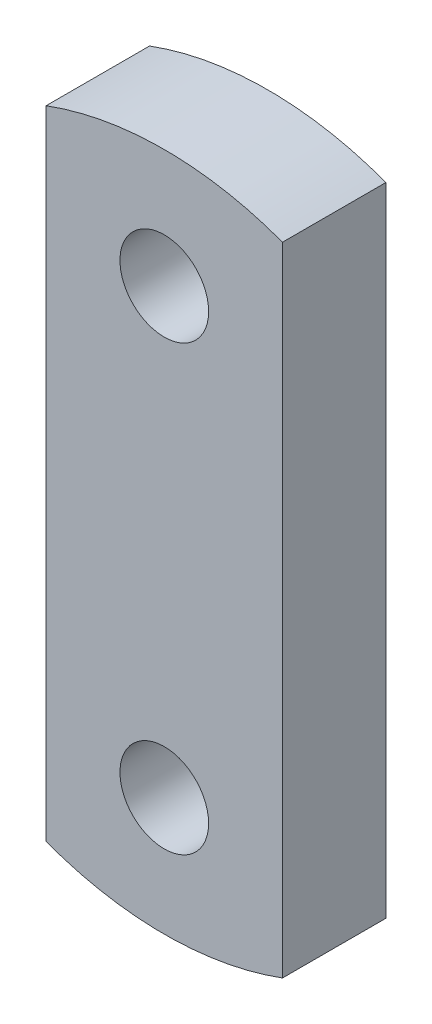
ISO-10303-21;
HEADER;
FILE_DESCRIPTION(('STEP AP214'),'2;1');
FILE_NAME('part.step','',(''),(''),'','','');
FILE_SCHEMA(('AUTOMOTIVE_DESIGN { 1 0 10303 214 1 1 1 1 }'));
ENDSEC;
DATA;
#1=APPLICATION_CONTEXT('core data for automotive mechanical design processes');
#2=APPLICATION_PROTOCOL_DEFINITION('international standard','automotive_design',2000,#1);
#3=PRODUCT_CONTEXT('',#1,'mechanical');
#4=PRODUCT('Part','Part','',(#3));
#5=PRODUCT_RELATED_PRODUCT_CATEGORY('part','',(#4));
#6=PRODUCT_DEFINITION_FORMATION('','',#4);
#7=PRODUCT_DEFINITION_CONTEXT('part definition',#1,'design');
#8=PRODUCT_DEFINITION('design','',#6,#7);
#9=PRODUCT_DEFINITION_SHAPE('','',#8);
#10=(LENGTH_UNIT() NAMED_UNIT(*) SI_UNIT(.MILLI.,.METRE.));
#11=(NAMED_UNIT(*) PLANE_ANGLE_UNIT() SI_UNIT($,.RADIAN.));
#12=(NAMED_UNIT(*) SI_UNIT($,.STERADIAN.) SOLID_ANGLE_UNIT());
#13=UNCERTAINTY_MEASURE_WITH_UNIT(LENGTH_MEASURE(1.E-05),#10,'distance_accuracy_value','');
#14=(GEOMETRIC_REPRESENTATION_CONTEXT(3) GLOBAL_UNCERTAINTY_ASSIGNED_CONTEXT((#13)) GLOBAL_UNIT_ASSIGNED_CONTEXT((#10,
#11,#12)) REPRESENTATION_CONTEXT('',''));
#15=CARTESIAN_POINT('',(0.,0.,0.));
#16=DIRECTION('',(0.,0.,1.));
#17=DIRECTION('',(1.,0.,0.));
#18=AXIS2_PLACEMENT_3D('',#15,#16,#17);
#19=CARTESIAN_POINT('',(0.,0.,35.));
#20=DIRECTION('',(0.,0.,1.));
#21=DIRECTION('',(1.,0.,0.));
#22=AXIS2_PLACEMENT_3D('',#19,#20,#21);
#23=PLANE('',#22);
#24=CARTESIAN_POINT('',(0.,75.,35.));
#25=DIRECTION('',(0.,0.,1.));
#26=DIRECTION('',(1.,0.,0.));
#27=AXIS2_PLACEMENT_3D('',#24,#25,#26);
#28=CIRCLE('',#27,15.);
#29=CARTESIAN_POINT('',(15.,75.,35.));
#30=VERTEX_POINT('',#29);
#31=EDGE_CURVE('E100',#30,#30,#28,.T.);
#32=ORIENTED_EDGE('',*,*,#31,.F.);
#33=EDGE_LOOP('',(#32));
#34=FACE_BOUND('',#33,.T.);
#35=CARTESIAN_POINT('',(0.,0.,35.));
#36=DIRECTION('',(0.,0.,1.));
#37=DIRECTION('',(1.,0.,0.));
#38=AXIS2_PLACEMENT_3D('',#35,#36,#37);
#39=CIRCLE('',#38,115.);
#40=CARTESIAN_POINT('',(40.,107.819293264239,35.));
#41=VERTEX_POINT('',#40);
#42=CARTESIAN_POINT('',(-40.,107.819293264239,35.));
#43=VERTEX_POINT('',#42);
#44=EDGE_CURVE('E85',#41,#43,#39,.T.);
#45=ORIENTED_EDGE('',*,*,#44,.T.);
#46=DIRECTION('',(0.,-1.,0.));
#47=VECTOR('',#46,1.);
#48=CARTESIAN_POINT('',(-40.,107.819293264239,35.));
#49=LINE('',#48,#47);
#50=CARTESIAN_POINT('',(-40.,-107.819293264239,35.));
#51=VERTEX_POINT('',#50);
#52=EDGE_CURVE('E80',#43,#51,#49,.T.);
#53=ORIENTED_EDGE('',*,*,#52,.T.);
#54=CARTESIAN_POINT('',(0.,0.,35.));
#55=DIRECTION('',(0.,0.,1.));
#56=DIRECTION('',(1.,0.,0.));
#57=AXIS2_PLACEMENT_3D('',#54,#55,#56);
#58=CIRCLE('',#57,115.);
#59=CARTESIAN_POINT('',(40.,-107.819293264239,35.));
#60=VERTEX_POINT('',#59);
#61=EDGE_CURVE('E83',#51,#60,#58,.T.);
#62=ORIENTED_EDGE('',*,*,#61,.T.);
#63=DIRECTION('',(0.,1.,0.));
#64=VECTOR('',#63,1.);
#65=CARTESIAN_POINT('',(40.,107.819293264239,35.));
#66=LINE('',#65,#64);
#67=EDGE_CURVE('E50',#60,#41,#66,.T.);
#68=ORIENTED_EDGE('',*,*,#67,.T.);
#69=EDGE_LOOP('',(#45,#53,#62,#68));
#70=FACE_BOUND('',#69,.T.);
#71=CARTESIAN_POINT('',(0.,-75.,35.));
#72=DIRECTION('',(0.,0.,1.));
#73=DIRECTION('',(1.,0.,0.));
#74=AXIS2_PLACEMENT_3D('',#71,#72,#73);
#75=CIRCLE('',#74,15.);
#76=CARTESIAN_POINT('',(15.,-75.,35.));
#77=VERTEX_POINT('',#76);
#78=EDGE_CURVE('E115',#77,#77,#75,.T.);
#79=ORIENTED_EDGE('',*,*,#78,.F.);
#80=EDGE_LOOP('',(#79));
#81=FACE_BOUND('',#80,.T.);
#82=ADVANCED_FACE('F33',(#34,#70,#81),#23,.T.);
#83=CARTESIAN_POINT('',(0.,0.,0.));
#84=DIRECTION('',(0.,0.,1.));
#85=DIRECTION('',(1.,0.,0.));
#86=AXIS2_PLACEMENT_3D('',#83,#84,#85);
#87=PLANE('',#86);
#88=CARTESIAN_POINT('',(0.,0.,0.));
#89=DIRECTION('',(0.,0.,1.));
#90=DIRECTION('',(1.,0.,0.));
#91=AXIS2_PLACEMENT_3D('',#88,#89,#90);
#92=CIRCLE('',#91,115.);
#93=CARTESIAN_POINT('',(40.,107.819293264239,0.));
#94=VERTEX_POINT('',#93);
#95=CARTESIAN_POINT('',(-40.,107.819293264239,0.));
#96=VERTEX_POINT('',#95);
#97=EDGE_CURVE('E97',#94,#96,#92,.T.);
#98=ORIENTED_EDGE('',*,*,#97,.F.);
#99=DIRECTION('',(0.,1.,0.));
#100=VECTOR('',#99,1.);
#101=CARTESIAN_POINT('',(40.,107.819293264239,0.));
#102=LINE('',#101,#100);
#103=CARTESIAN_POINT('',(40.,-107.819293264239,0.));
#104=VERTEX_POINT('',#103);
#105=EDGE_CURVE('E73',#104,#94,#102,.T.);
#106=ORIENTED_EDGE('',*,*,#105,.F.);
#107=CARTESIAN_POINT('',(0.,0.,0.));
#108=DIRECTION('',(0.,0.,1.));
#109=DIRECTION('',(1.,0.,0.));
#110=AXIS2_PLACEMENT_3D('',#107,#108,#109);
#111=CIRCLE('',#110,115.);
#112=CARTESIAN_POINT('',(-40.,-107.819293264239,0.));
#113=VERTEX_POINT('',#112);
#114=EDGE_CURVE('E67',#113,#104,#111,.T.);
#115=ORIENTED_EDGE('',*,*,#114,.F.);
#116=DIRECTION('',(0.,-1.,0.));
#117=VECTOR('',#116,1.);
#118=CARTESIAN_POINT('',(-40.,107.819293264239,0.));
#119=LINE('',#118,#117);
#120=EDGE_CURVE('E89',#96,#113,#119,.T.);
#121=ORIENTED_EDGE('',*,*,#120,.F.);
#122=EDGE_LOOP('',(#98,#106,#115,#121));
#123=FACE_BOUND('',#122,.T.);
#124=CARTESIAN_POINT('',(0.,75.,0.));
#125=DIRECTION('',(0.,0.,1.));
#126=DIRECTION('',(1.,0.,0.));
#127=AXIS2_PLACEMENT_3D('',#124,#125,#126);
#128=CIRCLE('',#127,15.);
#129=CARTESIAN_POINT('',(15.,75.,0.));
#130=VERTEX_POINT('',#129);
#131=EDGE_CURVE('E112',#130,#130,#128,.T.);
#132=ORIENTED_EDGE('',*,*,#131,.T.);
#133=EDGE_LOOP('',(#132));
#134=FACE_BOUND('',#133,.T.);
#135=CARTESIAN_POINT('',(0.,-75.,0.));
#136=DIRECTION('',(0.,0.,1.));
#137=DIRECTION('',(1.,0.,0.));
#138=AXIS2_PLACEMENT_3D('',#135,#136,#137);
#139=CIRCLE('',#138,15.);
#140=CARTESIAN_POINT('',(15.,-75.,0.));
#141=VERTEX_POINT('',#140);
#142=EDGE_CURVE('E118',#141,#141,#139,.T.);
#143=ORIENTED_EDGE('',*,*,#142,.T.);
#144=EDGE_LOOP('',(#143));
#145=FACE_BOUND('',#144,.T.);
#146=ADVANCED_FACE('F108',(#123,#134,#145),#87,.F.);
#147=CARTESIAN_POINT('',(0.,0.,35.));
#148=DIRECTION('',(0.,0.,-1.));
#149=DIRECTION('',(-1.,0.,0.));
#150=AXIS2_PLACEMENT_3D('',#147,#148,#149);
#151=CYLINDRICAL_SURFACE('',#150,115.);
#152=ORIENTED_EDGE('',*,*,#97,.T.);
#153=DIRECTION('',(0.,0.,-1.));
#154=VECTOR('',#153,1.);
#155=CARTESIAN_POINT('',(-40.,107.819293264239,35.));
#156=LINE('',#155,#154);
#157=EDGE_CURVE('E11',#43,#96,#156,.T.);
#158=ORIENTED_EDGE('',*,*,#157,.F.);
#159=ORIENTED_EDGE('',*,*,#44,.F.);
#160=DIRECTION('',(0.,0.,-1.));
#161=VECTOR('',#160,1.);
#162=CARTESIAN_POINT('',(40.,107.819293264239,35.));
#163=LINE('',#162,#161);
#164=EDGE_CURVE('E93',#41,#94,#163,.T.);
#165=ORIENTED_EDGE('',*,*,#164,.T.);
#166=EDGE_LOOP('',(#152,#158,#159,#165));
#167=FACE_BOUND('',#166,.T.);
#168=ADVANCED_FACE('F35',(#167),#151,.T.);
#169=CARTESIAN_POINT('',(-40.,107.819293264239,35.));
#170=DIRECTION('',(1.,0.,0.));
#171=DIRECTION('',(0.,1.,0.));
#172=AXIS2_PLACEMENT_3D('',#169,#170,#171);
#173=PLANE('',#172);
#174=ORIENTED_EDGE('',*,*,#120,.T.);
#175=DIRECTION('',(0.,0.,-1.));
#176=VECTOR('',#175,1.);
#177=CARTESIAN_POINT('',(-40.,-107.819293264239,35.));
#178=LINE('',#177,#176);
#179=EDGE_CURVE('E42',#51,#113,#178,.T.);
#180=ORIENTED_EDGE('',*,*,#179,.F.);
#181=ORIENTED_EDGE('',*,*,#52,.F.);
#182=ORIENTED_EDGE('',*,*,#157,.T.);
#183=EDGE_LOOP('',(#174,#180,#181,#182));
#184=FACE_BOUND('',#183,.T.);
#185=ADVANCED_FACE('F88',(#184),#173,.F.);
#186=CARTESIAN_POINT('',(0.,0.,35.));
#187=DIRECTION('',(0.,0.,-1.));
#188=DIRECTION('',(-1.,0.,0.));
#189=AXIS2_PLACEMENT_3D('',#186,#187,#188);
#190=CYLINDRICAL_SURFACE('',#189,115.);
#191=ORIENTED_EDGE('',*,*,#114,.T.);
#192=DIRECTION('',(0.,0.,-1.));
#193=VECTOR('',#192,1.);
#194=CARTESIAN_POINT('',(40.,-107.819293264239,35.));
#195=LINE('',#194,#193);
#196=EDGE_CURVE('E90',#60,#104,#195,.T.);
#197=ORIENTED_EDGE('',*,*,#196,.F.);
#198=ORIENTED_EDGE('',*,*,#61,.F.);
#199=ORIENTED_EDGE('',*,*,#179,.T.);
#200=EDGE_LOOP('',(#191,#197,#198,#199));
#201=FACE_BOUND('',#200,.T.);
#202=ADVANCED_FACE('F91',(#201),#190,.T.);
#203=CARTESIAN_POINT('',(40.,107.819293264239,35.));
#204=DIRECTION('',(-1.,0.,0.));
#205=DIRECTION('',(0.,-1.,0.));
#206=AXIS2_PLACEMENT_3D('',#203,#204,#205);
#207=PLANE('',#206);
#208=ORIENTED_EDGE('',*,*,#105,.T.);
#209=ORIENTED_EDGE('',*,*,#164,.F.);
#210=ORIENTED_EDGE('',*,*,#67,.F.);
#211=ORIENTED_EDGE('',*,*,#196,.T.);
#212=EDGE_LOOP('',(#208,#209,#210,#211));
#213=FACE_BOUND('',#212,.T.);
#214=ADVANCED_FACE('F105',(#213),#207,.F.);
#215=CARTESIAN_POINT('',(0.,75.,35.));
#216=DIRECTION('',(0.,0.,-1.));
#217=DIRECTION('',(-1.,0.,0.));
#218=AXIS2_PLACEMENT_3D('',#215,#216,#217);
#219=CYLINDRICAL_SURFACE('',#218,15.);
#220=ORIENTED_EDGE('',*,*,#31,.T.);
#221=EDGE_LOOP('',(#220));
#222=FACE_BOUND('',#221,.T.);
#223=ORIENTED_EDGE('',*,*,#131,.F.);
#224=EDGE_LOOP('',(#223));
#225=FACE_BOUND('',#224,.T.);
#226=ADVANCED_FACE('F135',(#222,#225),#219,.F.);
#227=CARTESIAN_POINT('',(0.,-75.,35.));
#228=DIRECTION('',(0.,0.,-1.));
#229=DIRECTION('',(-1.,0.,0.));
#230=AXIS2_PLACEMENT_3D('',#227,#228,#229);
#231=CYLINDRICAL_SURFACE('',#230,15.);
#232=ORIENTED_EDGE('',*,*,#78,.T.);
#233=EDGE_LOOP('',(#232));
#234=FACE_BOUND('',#233,.T.);
#235=ORIENTED_EDGE('',*,*,#142,.F.);
#236=EDGE_LOOP('',(#235));
#237=FACE_BOUND('',#236,.T.);
#238=ADVANCED_FACE('F124',(#234,#237),#231,.F.);
#239=CLOSED_SHELL('',(#82,#146,#168,#185,#202,#214,#226,#238));
#240=MANIFOLD_SOLID_BREP('B2',#239);
#241=ADVANCED_BREP_SHAPE_REPRESENTATION('',(#18,#240),#14);
#242=SHAPE_DEFINITION_REPRESENTATION(#9,#241);
ENDSEC;
END-ISO-10303-21;
